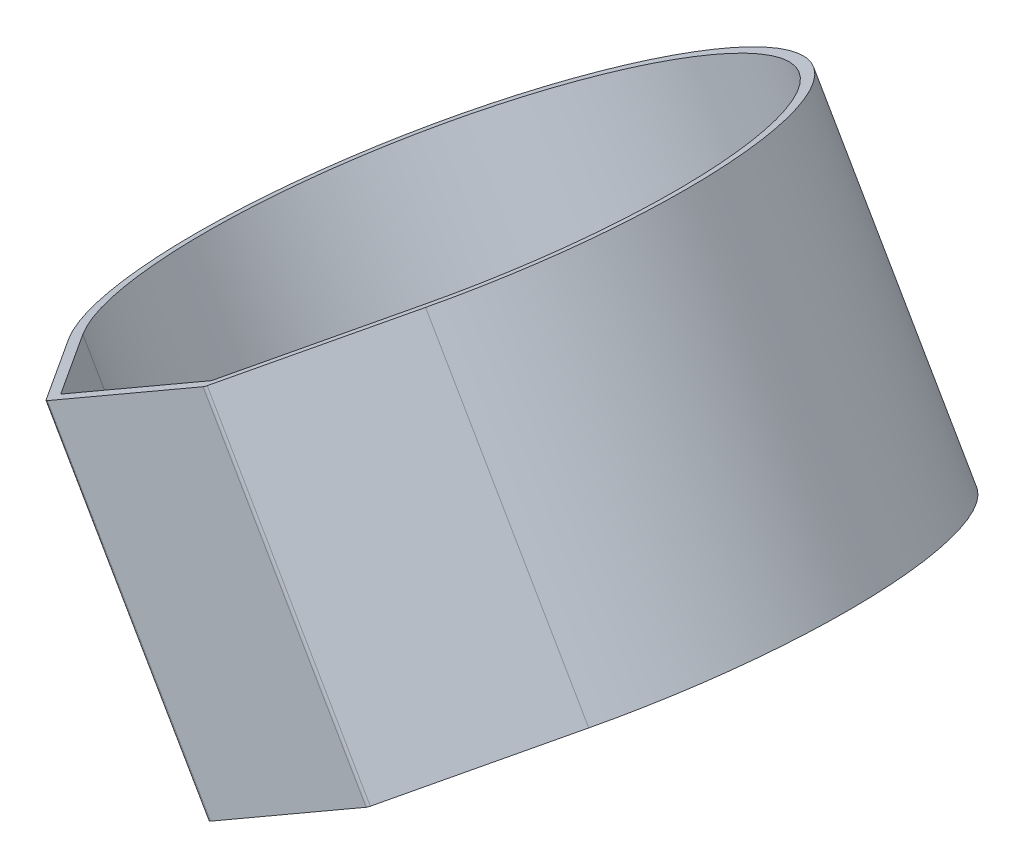
ISO-10303-21;
HEADER;
FILE_DESCRIPTION(('STEP AP214'),'2;1');
FILE_NAME('part.step','',(''),(''),'','','');
FILE_SCHEMA(('AUTOMOTIVE_DESIGN { 1 0 10303 214 1 1 1 1 }'));
ENDSEC;
DATA;
#1=APPLICATION_CONTEXT('core data for automotive mechanical design processes');
#2=APPLICATION_PROTOCOL_DEFINITION('international standard','automotive_design',2000,#1);
#3=PRODUCT_CONTEXT('',#1,'mechanical');
#4=PRODUCT('Part','Part','',(#3));
#5=PRODUCT_RELATED_PRODUCT_CATEGORY('part','',(#4));
#6=PRODUCT_DEFINITION_FORMATION('','',#4);
#7=PRODUCT_DEFINITION_CONTEXT('part definition',#1,'design');
#8=PRODUCT_DEFINITION('design','',#6,#7);
#9=PRODUCT_DEFINITION_SHAPE('','',#8);
#10=(LENGTH_UNIT() NAMED_UNIT(*) SI_UNIT(.MILLI.,.METRE.));
#11=(NAMED_UNIT(*) PLANE_ANGLE_UNIT() SI_UNIT($,.RADIAN.));
#12=(NAMED_UNIT(*) SI_UNIT($,.STERADIAN.) SOLID_ANGLE_UNIT());
#13=UNCERTAINTY_MEASURE_WITH_UNIT(LENGTH_MEASURE(1.E-05),#10,'distance_accuracy_value','');
#14=(GEOMETRIC_REPRESENTATION_CONTEXT(3) GLOBAL_UNCERTAINTY_ASSIGNED_CONTEXT((#13)) GLOBAL_UNIT_ASSIGNED_CONTEXT((#10,
#11,#12)) REPRESENTATION_CONTEXT('',''));
#15=CARTESIAN_POINT('',(0.,0.,0.));
#16=DIRECTION('',(0.,0.,1.));
#17=DIRECTION('',(1.,0.,0.));
#18=AXIS2_PLACEMENT_3D('',#15,#16,#17);
#19=CARTESIAN_POINT('',(-65.9270407936168,789.7806174903,-372.057743681072));
#20=DIRECTION('',(-0.499999999999999,0.866025403784439,0.));
#21=DIRECTION('',(-0.866025403784439,-0.499999999999999,0.));
#22=AXIS2_PLACEMENT_3D('',#19,#20,#21);
#23=CYLINDRICAL_SURFACE('',#22,0.2);
#24=CARTESIAN_POINT('',(-65.9270407936168,789.7806174903,-372.057743681072));
#25=DIRECTION('',(-0.499999999999999,0.866025403784439,0.));
#26=DIRECTION('',(-0.866025403784439,-0.499999999999999,0.));
#27=AXIS2_PLACEMENT_3D('',#24,#25,#26);
#28=CIRCLE('',#27,0.2);
#29=CARTESIAN_POINT('',(-65.9270407936166,789.7806174903,-371.857743681072));
#30=VERTEX_POINT('',#29);
#31=CARTESIAN_POINT('',(-65.8007871235376,789.853510080706,-371.920825161304));
#32=VERTEX_POINT('',#31);
#33=EDGE_CURVE('E20',#30,#32,#28,.T.);
#34=ORIENTED_EDGE('',*,*,#33,.T.);
#35=DIRECTION('',(0.499999999999993,-0.866025403784443,0.));
#36=VECTOR('',#35,1.);
#37=CARTESIAN_POINT('',(-73.3007871235379,802.843891137473,-371.920825161304));
#38=LINE('',#37,#36);
#39=CARTESIAN_POINT('',(-73.3007871235379,802.843891137473,-371.920825161304));
#40=VERTEX_POINT('',#39);
#41=EDGE_CURVE('E88',#40,#32,#38,.T.);
#42=ORIENTED_EDGE('',*,*,#41,.F.);
#43=CARTESIAN_POINT('',(-73.4270407936168,802.770998547067,-372.057743681072));
#44=DIRECTION('',(-0.499999999999999,0.866025403784439,0.));
#45=DIRECTION('',(-0.866025403784439,-0.499999999999999,0.));
#46=AXIS2_PLACEMENT_3D('',#43,#44,#45);
#47=CIRCLE('',#46,0.2);
#48=CARTESIAN_POINT('',(-73.4270407936168,802.770998547066,-371.857743681072));
#49=VERTEX_POINT('',#48);
#50=EDGE_CURVE('E136',#40,#49,#47,.F.);
#51=ORIENTED_EDGE('',*,*,#50,.T.);
#52=DIRECTION('',(-0.500000000000014,0.866025403784431,0.));
#53=VECTOR('',#52,1.);
#54=CARTESIAN_POINT('',(-65.9270407936168,789.7806174903,-371.857743681072));
#55=LINE('',#54,#53);
#56=EDGE_CURVE('E91',#30,#49,#55,.T.);
#57=ORIENTED_EDGE('',*,*,#56,.F.);
#58=EDGE_LOOP('',(#34,#42,#51,#57));
#59=FACE_BOUND('',#58,.T.);
#60=ADVANCED_FACE('F17',(#59),#23,.T.);
#61=CARTESIAN_POINT('',(-65.8520946789502,789.823887649777,-371.857743681072));
#62=DIRECTION('',(0.,0.,1.));
#63=DIRECTION('',(1.,0.,0.));
#64=AXIS2_PLACEMENT_3D('',#61,#62,#63);
#65=PLANE('',#64);
#66=DIRECTION('',(0.866025403784439,0.499999999999999,0.));
#67=VECTOR('',#66,1.);
#68=CARTESIAN_POINT('',(-69.5035615807543,787.715712251083,-371.857743681072));
#69=LINE('',#68,#67);
#70=CARTESIAN_POINT('',(-73.0800823678923,785.650807011867,-371.857743681072));
#71=VERTEX_POINT('',#70);
#72=EDGE_CURVE('E98',#30,#71,#69,.F.);
#73=ORIENTED_EDGE('',*,*,#72,.F.);
#74=ORIENTED_EDGE('',*,*,#56,.T.);
#75=DIRECTION('',(0.866025403784439,0.499999999999999,0.));
#76=VECTOR('',#75,1.);
#77=CARTESIAN_POINT('',(-77.0035615807543,800.70609330785,-371.857743681072));
#78=LINE('',#77,#76);
#79=CARTESIAN_POINT('',(-80.5800823678924,798.641188068634,-371.857743681072));
#80=VERTEX_POINT('',#79);
#81=EDGE_CURVE('E133',#49,#80,#78,.F.);
#82=ORIENTED_EDGE('',*,*,#81,.T.);
#83=DIRECTION('',(-0.499999999999999,0.866025403784439,0.));
#84=VECTOR('',#83,1.);
#85=CARTESIAN_POINT('',(-73.0800823678923,785.650807011867,-371.857743681072));
#86=LINE('',#85,#84);
#87=EDGE_CURVE('E148',#71,#80,#86,.T.);
#88=ORIENTED_EDGE('',*,*,#87,.F.);
#89=EDGE_LOOP('',(#73,#74,#82,#88));
#90=FACE_BOUND('',#89,.T.);
#91=ADVANCED_FACE('F176',(#90),#65,.T.);
#92=CARTESIAN_POINT('',(-66.0394599656168,789.715712251083,-372.357743681072));
#93=DIRECTION('',(0.,0.,1.));
#94=DIRECTION('',(1.,0.,0.));
#95=AXIS2_PLACEMENT_3D('',#92,#93,#94);
#96=PLANE('',#95);
#97=DIRECTION('',(0.499999999999992,-0.866025403784443,0.));
#98=VECTOR('',#97,1.);
#99=CARTESIAN_POINT('',(-73.5394599656169,802.70609330785,-372.357743681072));
#100=LINE('',#99,#98);
#101=CARTESIAN_POINT('',(-73.5394599656168,802.70609330785,-372.357743681072));
#102=VERTEX_POINT('',#101);
#103=CARTESIAN_POINT('',(-66.0394599656167,789.715712251083,-372.357743681072));
#104=VERTEX_POINT('',#103);
#105=EDGE_CURVE('E154',#102,#104,#100,.T.);
#106=ORIENTED_EDGE('',*,*,#105,.T.);
#107=DIRECTION('',(0.866025403784439,0.499999999999999,0.));
#108=VECTOR('',#107,1.);
#109=CARTESIAN_POINT('',(-69.5035615807543,787.715712251083,-372.357743681072));
#110=LINE('',#109,#108);
#111=CARTESIAN_POINT('',(-72.9676631958923,785.715712251083,-372.357743681072));
#112=VERTEX_POINT('',#111);
#113=EDGE_CURVE('E103',#112,#104,#110,.T.);
#114=ORIENTED_EDGE('',*,*,#113,.F.);
#115=DIRECTION('',(-0.499999999999993,0.866025403784443,0.));
#116=VECTOR('',#115,1.);
#117=CARTESIAN_POINT('',(-72.9676631958923,785.715712251083,-372.357743681072));
#118=LINE('',#117,#116);
#119=CARTESIAN_POINT('',(-80.4676631958923,798.70609330785,-372.357743681072));
#120=VERTEX_POINT('',#119);
#121=EDGE_CURVE('E144',#112,#120,#118,.T.);
#122=ORIENTED_EDGE('',*,*,#121,.T.);
#123=DIRECTION('',(0.866025403784439,0.499999999999999,0.));
#124=VECTOR('',#123,1.);
#125=CARTESIAN_POINT('',(-77.0035615807543,800.70609330785,-372.357743681072));
#126=LINE('',#125,#124);
#127=EDGE_CURVE('E130',#120,#102,#126,.T.);
#128=ORIENTED_EDGE('',*,*,#127,.T.);
#129=EDGE_LOOP('',(#106,#114,#122,#128));
#130=FACE_BOUND('',#129,.T.);
#131=ADVANCED_FACE('F217',(#130),#96,.F.);
#132=CARTESIAN_POINT('',(-61.6127072008097,792.271499151481,-377.800336195585));
#133=DIRECTION('',(0.631268350395587,0.364462952031782,0.684592598838983));
#134=DIRECTION('',(0.735158341569272,0.,-0.677895429119505));
#135=AXIS2_PLACEMENT_3D('',#132,#133,#134);
#136=PLANE('',#135);
#137=DIRECTION('',(-0.499999999999999,0.866025403784439,0.));
#138=VECTOR('',#137,1.);
#139=CARTESIAN_POINT('',(-61.6127072008096,792.27149915148,-377.800336195585));
#140=LINE('',#139,#138);
#141=CARTESIAN_POINT('',(-69.1127072008097,805.261880208247,-377.800336195585));
#142=VERTEX_POINT('',#141);
#143=CARTESIAN_POINT('',(-61.6127072008097,792.27149915148,-377.800336195585));
#144=VERTEX_POINT('',#143);
#145=EDGE_CURVE('E145',#142,#144,#140,.F.);
#146=ORIENTED_EDGE('',*,*,#145,.T.);
#147=DIRECTION('',(0.59287458183737,0.342296299419495,-0.728925904063563));
#148=VECTOR('',#147,1.);
#149=CARTESIAN_POINT('',(-66.0394599656167,789.715712251083,-372.357743681072));
#150=LINE('',#149,#148);
#151=EDGE_CURVE('E107',#104,#144,#150,.T.);
#152=ORIENTED_EDGE('',*,*,#151,.F.);
#153=ORIENTED_EDGE('',*,*,#105,.F.);
#154=DIRECTION('',(0.592874581837343,0.342296299419479,-0.728925904063593));
#155=VECTOR('',#154,1.);
#156=CARTESIAN_POINT('',(-73.5394599656167,802.70609330785,-372.357743681072));
#157=LINE('',#156,#155);
#158=EDGE_CURVE('E128',#102,#142,#157,.T.);
#159=ORIENTED_EDGE('',*,*,#158,.T.);
#160=EDGE_LOOP('',(#146,#152,#153,#159));
#161=FACE_BOUND('',#160,.T.);
#162=ADVANCED_FACE('F213',(#161),#136,.F.);
#163=CARTESIAN_POINT('',(-69.5035615807545,787.715712251083,-386.357743681072));
#164=DIRECTION('',(-0.499999999999999,0.866025403784439,0.));
#165=DIRECTION('',(-0.866025403784439,-0.499999999999999,0.));
#166=AXIS2_PLACEMENT_3D('',#163,#164,#165);
#167=CYLINDRICAL_SURFACE('',#166,12.4999999999999);
#168=DIRECTION('',(0.499999999999996,-0.866025403784441,0.));
#169=VECTOR('',#168,1.);
#170=CARTESIAN_POINT('',(-84.8944159606996,796.150306407453,-377.800336195585));
#171=LINE('',#170,#169);
#172=CARTESIAN_POINT('',(-84.8944159606997,796.150306407453,-377.800336195585));
#173=VERTEX_POINT('',#172);
#174=CARTESIAN_POINT('',(-77.3944159606996,783.159925350686,-377.800336195585));
#175=VERTEX_POINT('',#174);
#176=EDGE_CURVE('E142',#173,#175,#171,.T.);
#177=ORIENTED_EDGE('',*,*,#176,.T.);
#178=CARTESIAN_POINT('',(-69.5035615807548,787.715712251084,-386.357743681072));
#179=DIRECTION('',(-0.499999999999999,0.866025403784439,0.));
#180=DIRECTION('',(-0.866025403784439,-0.499999999999999,0.));
#181=AXIS2_PLACEMENT_3D('',#178,#179,#180);
#182=CIRCLE('',#181,12.4999999999999);
#183=EDGE_CURVE('E169',#144,#175,#182,.T.);
#184=ORIENTED_EDGE('',*,*,#183,.F.);
#185=ORIENTED_EDGE('',*,*,#145,.F.);
#186=CARTESIAN_POINT('',(-77.0035615807548,800.70609330785,-386.357743681072));
#187=DIRECTION('',(-0.499999999999999,0.866025403784439,0.));
#188=DIRECTION('',(-0.866025403784439,-0.499999999999999,0.));
#189=AXIS2_PLACEMENT_3D('',#186,#187,#188);
#190=CIRCLE('',#189,12.4999999999999);
#191=EDGE_CURVE('E125',#142,#173,#190,.T.);
#192=ORIENTED_EDGE('',*,*,#191,.T.);
#193=EDGE_LOOP('',(#177,#184,#185,#192));
#194=FACE_BOUND('',#193,.T.);
#195=ADVANCED_FACE('F209',(#194),#167,.F.);
#196=CARTESIAN_POINT('',(-72.9676631958923,785.715712251083,-372.357743681072));
#197=DIRECTION('',(-0.631268350395587,-0.364462952031782,0.684592598838983));
#198=DIRECTION('',(0.735158341569272,0.,0.677895429119505));
#199=AXIS2_PLACEMENT_3D('',#196,#197,#198);
#200=PLANE('',#199);
#201=ORIENTED_EDGE('',*,*,#121,.F.);
#202=DIRECTION('',(0.592874581837337,0.342296299419469,0.728925904063602));
#203=VECTOR('',#202,1.);
#204=CARTESIAN_POINT('',(-77.3944159606991,783.159925350686,-377.800336195585));
#205=LINE('',#204,#203);
#206=EDGE_CURVE('E139',#175,#112,#205,.T.);
#207=ORIENTED_EDGE('',*,*,#206,.F.);
#208=ORIENTED_EDGE('',*,*,#176,.F.);
#209=DIRECTION('',(0.592874581837337,0.342296299419469,0.728925904063602));
#210=VECTOR('',#209,1.);
#211=CARTESIAN_POINT('',(-84.8944159606991,796.150306407453,-377.800336195585));
#212=LINE('',#211,#210);
#213=EDGE_CURVE('E122',#173,#120,#212,.T.);
#214=ORIENTED_EDGE('',*,*,#213,.T.);
#215=EDGE_LOOP('',(#201,#207,#208,#214));
#216=FACE_BOUND('',#215,.T.);
#217=ADVANCED_FACE('F206',(#216),#200,.F.);
#218=CARTESIAN_POINT('',(-73.0800823678923,785.650807011867,-372.057743681072));
#219=DIRECTION('',(-0.499999999999999,0.866025403784439,0.));
#220=DIRECTION('',(-0.866025403784439,-0.499999999999999,0.));
#221=AXIS2_PLACEMENT_3D('',#218,#219,#220);
#222=CYLINDRICAL_SURFACE('',#221,0.2);
#223=CARTESIAN_POINT('',(-73.0800823678924,785.650807011867,-372.057743681072));
#224=DIRECTION('',(-0.499999999999999,0.866025403784439,0.));
#225=DIRECTION('',(-0.866025403784439,-0.499999999999999,0.));
#226=AXIS2_PLACEMENT_3D('',#223,#224,#225);
#227=CIRCLE('',#226,0.2);
#228=CARTESIAN_POINT('',(-73.2063360379715,785.577914421461,-371.920825161304));
#229=VERTEX_POINT('',#228);
#230=EDGE_CURVE('E104',#71,#229,#227,.F.);
#231=ORIENTED_EDGE('',*,*,#230,.F.);
#232=ORIENTED_EDGE('',*,*,#87,.T.);
#233=CARTESIAN_POINT('',(-80.5800823678925,798.641188068634,-372.057743681072));
#234=DIRECTION('',(-0.499999999999999,0.866025403784439,0.));
#235=DIRECTION('',(-0.866025403784439,-0.499999999999999,0.));
#236=AXIS2_PLACEMENT_3D('',#233,#234,#235);
#237=CIRCLE('',#236,0.2);
#238=CARTESIAN_POINT('',(-80.7063360379715,798.568295478227,-371.920825161304));
#239=VERTEX_POINT('',#238);
#240=EDGE_CURVE('E135',#80,#239,#237,.F.);
#241=ORIENTED_EDGE('',*,*,#240,.T.);
#242=DIRECTION('',(-0.500000000000007,0.866025403784435,0.));
#243=VECTOR('',#242,1.);
#244=CARTESIAN_POINT('',(-73.2063360379715,785.577914421461,-371.920825161304));
#245=LINE('',#244,#243);
#246=EDGE_CURVE('E119',#229,#239,#245,.T.);
#247=ORIENTED_EDGE('',*,*,#246,.F.);
#248=EDGE_LOOP('',(#231,#232,#241,#247));
#249=FACE_BOUND('',#248,.T.);
#250=ADVANCED_FACE('F183',(#249),#222,.T.);
#251=CARTESIAN_POINT('',(-77.0035615807543,800.70609330785,-384.802410743488));
#252=DIRECTION('',(0.499999999999999,-0.866025403784439,0.));
#253=DIRECTION('',(0.866025403784439,0.499999999999999,0.));
#254=AXIS2_PLACEMENT_3D('',#251,#252,#253);
#255=PLANE('',#254);
#256=ORIENTED_EDGE('',*,*,#191,.F.);
#257=ORIENTED_EDGE('',*,*,#158,.F.);
#258=ORIENTED_EDGE('',*,*,#127,.F.);
#259=ORIENTED_EDGE('',*,*,#213,.F.);
#260=EDGE_LOOP('',(#256,#257,#258,#259));
#261=FACE_BOUND('',#260,.T.);
#262=CARTESIAN_POINT('',(-77.0035615807547,800.70609330785,-386.357743681072));
#263=DIRECTION('',(-0.499999999999999,0.866025403784439,0.));
#264=DIRECTION('',(-0.866025403784439,-0.499999999999999,0.));
#265=AXIS2_PLACEMENT_3D('',#262,#263,#264);
#266=CIRCLE('',#265,13.);
#267=CARTESIAN_POINT('',(-85.2100501358974,795.968074931437,-377.458039896165));
#268=VERTEX_POINT('',#267);
#269=CARTESIAN_POINT('',(-68.7970730256121,805.444111684263,-377.458039896165));
#270=VERTEX_POINT('',#269);
#271=EDGE_CURVE('E116',#268,#270,#266,.F.);
#272=ORIENTED_EDGE('',*,*,#271,.F.);
#273=DIRECTION('',(-0.592874581837387,-0.342296299419445,-0.728925904063573));
#274=VECTOR('',#273,1.);
#275=CARTESIAN_POINT('',(-80.7063360379713,798.568295478227,-371.920825161304));
#276=LINE('',#275,#274);
#277=EDGE_CURVE('E120',#239,#268,#276,.T.);
#278=ORIENTED_EDGE('',*,*,#277,.F.);
#279=ORIENTED_EDGE('',*,*,#240,.F.);
#280=ORIENTED_EDGE('',*,*,#81,.F.);
#281=ORIENTED_EDGE('',*,*,#50,.F.);
#282=DIRECTION('',(-0.592874581837392,-0.342296299419449,0.728925904063567));
#283=VECTOR('',#282,1.);
#284=CARTESIAN_POINT('',(-68.797073025612,805.444111684263,-377.458039896165));
#285=LINE('',#284,#283);
#286=EDGE_CURVE('E97',#270,#40,#285,.T.);
#287=ORIENTED_EDGE('',*,*,#286,.F.);
#288=EDGE_LOOP('',(#272,#278,#279,#280,#281,#287));
#289=FACE_BOUND('',#288,.T.);
#290=ADVANCED_FACE('F178',(#261,#289),#255,.F.);
#291=CARTESIAN_POINT('',(-61.2970730256119,792.453730627496,-377.458039896165));
#292=DIRECTION('',(0.631268350395589,0.364462952031783,0.684592598838981));
#293=DIRECTION('',(0.73515834156927,0.,-0.677895429119507));
#294=AXIS2_PLACEMENT_3D('',#291,#292,#293);
#295=PLANE('',#294);
#296=DIRECTION('',(-0.592874581837342,-0.342296299419466,0.7289259040636));
#297=VECTOR('',#296,1.);
#298=CARTESIAN_POINT('',(-61.297073025612,792.453730627496,-377.458039896165));
#299=LINE('',#298,#297);
#300=CARTESIAN_POINT('',(-61.2970730256116,792.453730627496,-377.458039896165));
#301=VERTEX_POINT('',#300);
#302=EDGE_CURVE('E96',#301,#32,#299,.T.);
#303=ORIENTED_EDGE('',*,*,#302,.F.);
#304=DIRECTION('',(-0.499999999999999,0.866025403784439,0.));
#305=VECTOR('',#304,1.);
#306=CARTESIAN_POINT('',(-61.2970730256119,792.453730627496,-377.458039896165));
#307=LINE('',#306,#305);
#308=EDGE_CURVE('E115',#270,#301,#307,.F.);
#309=ORIENTED_EDGE('',*,*,#308,.F.);
#310=ORIENTED_EDGE('',*,*,#286,.T.);
#311=ORIENTED_EDGE('',*,*,#41,.T.);
#312=EDGE_LOOP('',(#303,#309,#310,#311));
#313=FACE_BOUND('',#312,.T.);
#314=ADVANCED_FACE('F94',(#313),#295,.T.);
#315=CARTESIAN_POINT('',(-69.5035615807543,787.715712251083,-384.802410743488));
#316=DIRECTION('',(0.499999999999999,-0.866025403784439,0.));
#317=DIRECTION('',(0.866025403784439,0.499999999999999,0.));
#318=AXIS2_PLACEMENT_3D('',#315,#316,#317);
#319=PLANE('',#318);
#320=ORIENTED_EDGE('',*,*,#183,.T.);
#321=ORIENTED_EDGE('',*,*,#206,.T.);
#322=ORIENTED_EDGE('',*,*,#113,.T.);
#323=ORIENTED_EDGE('',*,*,#151,.T.);
#324=EDGE_LOOP('',(#320,#321,#322,#323));
#325=FACE_BOUND('',#324,.T.);
#326=CARTESIAN_POINT('',(-69.5035615807545,787.715712251083,-386.357743681072));
#327=DIRECTION('',(-0.499999999999999,0.866025403784439,0.));
#328=DIRECTION('',(-0.866025403784439,-0.499999999999999,0.));
#329=AXIS2_PLACEMENT_3D('',#326,#327,#328);
#330=CIRCLE('',#329,13.);
#331=CARTESIAN_POINT('',(-77.7100501358972,782.97769387467,-377.458039896165));
#332=VERTEX_POINT('',#331);
#333=EDGE_CURVE('E26',#301,#332,#330,.T.);
#334=ORIENTED_EDGE('',*,*,#333,.F.);
#335=ORIENTED_EDGE('',*,*,#302,.T.);
#336=ORIENTED_EDGE('',*,*,#33,.F.);
#337=ORIENTED_EDGE('',*,*,#72,.T.);
#338=ORIENTED_EDGE('',*,*,#230,.T.);
#339=DIRECTION('',(0.592874581837341,0.342296299419538,0.728925904063567));
#340=VECTOR('',#339,1.);
#341=CARTESIAN_POINT('',(-77.7100501358972,782.97769387467,-377.458039896165));
#342=LINE('',#341,#340);
#343=EDGE_CURVE('E35',#332,#229,#342,.T.);
#344=ORIENTED_EDGE('',*,*,#343,.F.);
#345=EDGE_LOOP('',(#334,#335,#336,#337,#338,#344));
#346=FACE_BOUND('',#345,.T.);
#347=ADVANCED_FACE('F100',(#325,#346),#319,.T.);
#348=CARTESIAN_POINT('',(-73.1550284825588,785.607536852389,-371.857743681072));
#349=DIRECTION('',(-0.631268350395589,-0.364462952031783,0.684592598838981));
#350=DIRECTION('',(0.73515834156927,0.,0.677895429119507));
#351=AXIS2_PLACEMENT_3D('',#348,#349,#350);
#352=PLANE('',#351);
#353=ORIENTED_EDGE('',*,*,#343,.T.);
#354=ORIENTED_EDGE('',*,*,#246,.T.);
#355=ORIENTED_EDGE('',*,*,#277,.T.);
#356=DIRECTION('',(-0.499999999999999,0.866025403784439,0.));
#357=VECTOR('',#356,1.);
#358=CARTESIAN_POINT('',(-77.710050135897,782.97769387467,-377.458039896165));
#359=LINE('',#358,#357);
#360=EDGE_CURVE('E11',#332,#268,#359,.T.);
#361=ORIENTED_EDGE('',*,*,#360,.F.);
#362=EDGE_LOOP('',(#353,#354,#355,#361));
#363=FACE_BOUND('',#362,.T.);
#364=ADVANCED_FACE('F185',(#363),#352,.T.);
#365=CARTESIAN_POINT('',(-69.5035615807545,787.715712251083,-386.357743681072));
#366=DIRECTION('',(-0.499999999999999,0.866025403784439,0.));
#367=DIRECTION('',(-0.866025403784439,-0.499999999999999,0.));
#368=AXIS2_PLACEMENT_3D('',#365,#366,#367);
#369=CYLINDRICAL_SURFACE('',#368,13.);
#370=ORIENTED_EDGE('',*,*,#333,.T.);
#371=ORIENTED_EDGE('',*,*,#360,.T.);
#372=ORIENTED_EDGE('',*,*,#271,.T.);
#373=ORIENTED_EDGE('',*,*,#308,.T.);
#374=EDGE_LOOP('',(#370,#371,#372,#373));
#375=FACE_BOUND('',#374,.T.);
#376=ADVANCED_FACE('F187',(#375),#369,.T.);
#377=CLOSED_SHELL('',(#60,#91,#131,#162,#195,#217,#250,#290,#314,#347,#364,#376));
#378=MANIFOLD_SOLID_BREP('B1',#377);
#379=ADVANCED_BREP_SHAPE_REPRESENTATION('',(#18,#378),#14);
#380=SHAPE_DEFINITION_REPRESENTATION(#9,#379);
ENDSEC;
END-ISO-10303-21;
